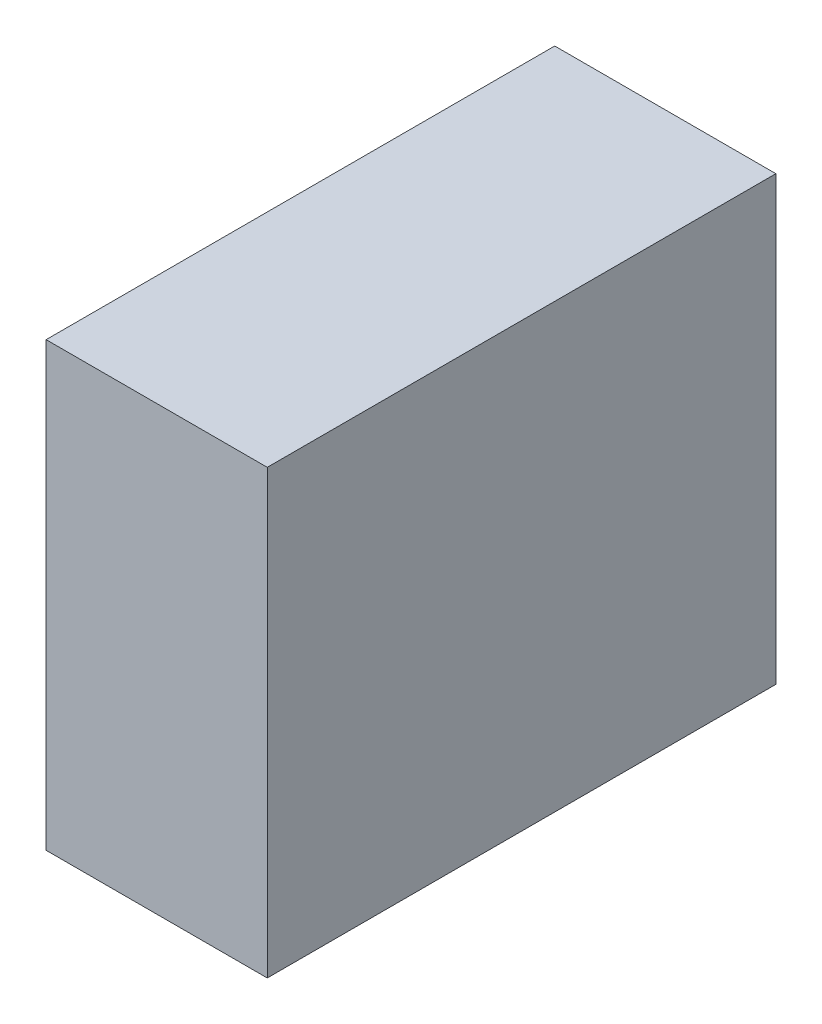
ISO-10303-21;
HEADER;
FILE_DESCRIPTION(('STEP AP214'),'2;1');
FILE_NAME('part.step','',(''),(''),'','','');
FILE_SCHEMA(('AUTOMOTIVE_DESIGN { 1 0 10303 214 1 1 1 1 }'));
ENDSEC;
DATA;
#1=APPLICATION_CONTEXT('core data for automotive mechanical design processes');
#2=APPLICATION_PROTOCOL_DEFINITION('international standard','automotive_design',2000,#1);
#3=PRODUCT_CONTEXT('',#1,'mechanical');
#4=PRODUCT('Part','Part','',(#3));
#5=PRODUCT_RELATED_PRODUCT_CATEGORY('part','',(#4));
#6=PRODUCT_DEFINITION_FORMATION('','',#4);
#7=PRODUCT_DEFINITION_CONTEXT('part definition',#1,'design');
#8=PRODUCT_DEFINITION('design','',#6,#7);
#9=PRODUCT_DEFINITION_SHAPE('','',#8);
#10=(LENGTH_UNIT() NAMED_UNIT(*) SI_UNIT(.MILLI.,.METRE.));
#11=(NAMED_UNIT(*) PLANE_ANGLE_UNIT() SI_UNIT($,.RADIAN.));
#12=(NAMED_UNIT(*) SI_UNIT($,.STERADIAN.) SOLID_ANGLE_UNIT());
#13=UNCERTAINTY_MEASURE_WITH_UNIT(LENGTH_MEASURE(1.E-05),#10,'distance_accuracy_value','');
#14=(GEOMETRIC_REPRESENTATION_CONTEXT(3) GLOBAL_UNCERTAINTY_ASSIGNED_CONTEXT((#13)) GLOBAL_UNIT_ASSIGNED_CONTEXT((#10,
#11,#12)) REPRESENTATION_CONTEXT('',''));
#15=CARTESIAN_POINT('',(0.,0.,0.));
#16=DIRECTION('',(0.,0.,1.));
#17=DIRECTION('',(1.,0.,0.));
#18=AXIS2_PLACEMENT_3D('',#15,#16,#17);
#19=CARTESIAN_POINT('',(-10.,0.,0.));
#20=DIRECTION('',(0.,0.,1.));
#21=DIRECTION('',(1.,0.,0.));
#22=AXIS2_PLACEMENT_3D('',#19,#20,#21);
#23=PLANE('',#22);
#24=DIRECTION('',(0.,-1.,0.));
#25=VECTOR('',#24,1.);
#26=CARTESIAN_POINT('',(0.,0.,0.));
#27=LINE('',#26,#25);
#28=CARTESIAN_POINT('',(0.,20.,0.));
#29=VERTEX_POINT('',#28);
#30=CARTESIAN_POINT('',(0.,0.,0.));
#31=VERTEX_POINT('',#30);
#32=EDGE_CURVE('E104',#29,#31,#27,.T.);
#33=ORIENTED_EDGE('',*,*,#32,.F.);
#34=DIRECTION('',(1.,0.,0.));
#35=VECTOR('',#34,1.);
#36=CARTESIAN_POINT('',(-10.,20.,0.));
#37=LINE('',#36,#35);
#38=CARTESIAN_POINT('',(-10.,20.,0.));
#39=VERTEX_POINT('',#38);
#40=EDGE_CURVE('E11',#39,#29,#37,.T.);
#41=ORIENTED_EDGE('',*,*,#40,.F.);
#42=DIRECTION('',(0.,-1.,0.));
#43=VECTOR('',#42,1.);
#44=CARTESIAN_POINT('',(-10.,0.,0.));
#45=LINE('',#44,#43);
#46=CARTESIAN_POINT('',(-10.,0.,0.));
#47=VERTEX_POINT('',#46);
#48=EDGE_CURVE('E100',#39,#47,#45,.T.);
#49=ORIENTED_EDGE('',*,*,#48,.T.);
#50=DIRECTION('',(1.,0.,0.));
#51=VECTOR('',#50,1.);
#52=CARTESIAN_POINT('',(-10.,0.,0.));
#53=LINE('',#52,#51);
#54=EDGE_CURVE('E45',#47,#31,#53,.T.);
#55=ORIENTED_EDGE('',*,*,#54,.T.);
#56=EDGE_LOOP('',(#33,#41,#49,#55));
#57=FACE_BOUND('',#56,.T.);
#58=ADVANCED_FACE('F39',(#57),#23,.T.);
#59=CARTESIAN_POINT('',(-10.,20.,0.));
#60=DIRECTION('',(0.,1.,0.));
#61=DIRECTION('',(0.,0.,1.));
#62=AXIS2_PLACEMENT_3D('',#59,#60,#61);
#63=PLANE('',#62);
#64=DIRECTION('',(0.,0.,1.));
#65=VECTOR('',#64,1.);
#66=CARTESIAN_POINT('',(0.,20.,0.));
#67=LINE('',#66,#65);
#68=CARTESIAN_POINT('',(0.,20.,-23.));
#69=VERTEX_POINT('',#68);
#70=EDGE_CURVE('E98',#69,#29,#67,.T.);
#71=ORIENTED_EDGE('',*,*,#70,.F.);
#72=DIRECTION('',(1.,0.,0.));
#73=VECTOR('',#72,1.);
#74=CARTESIAN_POINT('',(-10.,20.,-23.));
#75=LINE('',#74,#73);
#76=CARTESIAN_POINT('',(-10.,20.,-23.));
#77=VERTEX_POINT('',#76);
#78=EDGE_CURVE('E48',#77,#69,#75,.T.);
#79=ORIENTED_EDGE('',*,*,#78,.F.);
#80=DIRECTION('',(0.,0.,1.));
#81=VECTOR('',#80,1.);
#82=CARTESIAN_POINT('',(-10.,20.,0.));
#83=LINE('',#82,#81);
#84=EDGE_CURVE('E92',#77,#39,#83,.T.);
#85=ORIENTED_EDGE('',*,*,#84,.T.);
#86=ORIENTED_EDGE('',*,*,#40,.T.);
#87=EDGE_LOOP('',(#71,#79,#85,#86));
#88=FACE_BOUND('',#87,.T.);
#89=ADVANCED_FACE('F111',(#88),#63,.T.);
#90=CARTESIAN_POINT('',(-10.,0.,-23.));
#91=DIRECTION('',(0.,0.,-1.));
#92=DIRECTION('',(-1.,0.,0.));
#93=AXIS2_PLACEMENT_3D('',#90,#91,#92);
#94=PLANE('',#93);
#95=DIRECTION('',(0.,1.,0.));
#96=VECTOR('',#95,1.);
#97=CARTESIAN_POINT('',(0.,0.,-23.));
#98=LINE('',#97,#96);
#99=CARTESIAN_POINT('',(0.,0.,-23.));
#100=VERTEX_POINT('',#99);
#101=EDGE_CURVE('E87',#100,#69,#98,.T.);
#102=ORIENTED_EDGE('',*,*,#101,.F.);
#103=DIRECTION('',(1.,0.,0.));
#104=VECTOR('',#103,1.);
#105=CARTESIAN_POINT('',(-10.,0.,-23.));
#106=LINE('',#105,#104);
#107=CARTESIAN_POINT('',(-10.,0.,-23.));
#108=VERTEX_POINT('',#107);
#109=EDGE_CURVE('E84',#108,#100,#106,.T.);
#110=ORIENTED_EDGE('',*,*,#109,.F.);
#111=DIRECTION('',(0.,1.,0.));
#112=VECTOR('',#111,1.);
#113=CARTESIAN_POINT('',(-10.,0.,-23.));
#114=LINE('',#113,#112);
#115=EDGE_CURVE('E90',#108,#77,#114,.T.);
#116=ORIENTED_EDGE('',*,*,#115,.T.);
#117=ORIENTED_EDGE('',*,*,#78,.T.);
#118=EDGE_LOOP('',(#102,#110,#116,#117));
#119=FACE_BOUND('',#118,.T.);
#120=ADVANCED_FACE('F86',(#119),#94,.T.);
#121=CARTESIAN_POINT('',(-10.,0.,0.));
#122=DIRECTION('',(0.,-1.,0.));
#123=DIRECTION('',(0.,0.,-1.));
#124=AXIS2_PLACEMENT_3D('',#121,#122,#123);
#125=PLANE('',#124);
#126=DIRECTION('',(0.,0.,-1.));
#127=VECTOR('',#126,1.);
#128=CARTESIAN_POINT('',(0.,0.,0.));
#129=LINE('',#128,#127);
#130=EDGE_CURVE('E106',#31,#100,#129,.T.);
#131=ORIENTED_EDGE('',*,*,#130,.F.);
#132=ORIENTED_EDGE('',*,*,#54,.F.);
#133=DIRECTION('',(0.,0.,-1.));
#134=VECTOR('',#133,1.);
#135=CARTESIAN_POINT('',(-10.,0.,0.));
#136=LINE('',#135,#134);
#137=EDGE_CURVE('E93',#47,#108,#136,.T.);
#138=ORIENTED_EDGE('',*,*,#137,.T.);
#139=ORIENTED_EDGE('',*,*,#109,.T.);
#140=EDGE_LOOP('',(#131,#132,#138,#139));
#141=FACE_BOUND('',#140,.T.);
#142=ADVANCED_FACE('F96',(#141),#125,.T.);
#143=CARTESIAN_POINT('',(-10.,0.,0.));
#144=DIRECTION('',(-1.,0.,0.));
#145=DIRECTION('',(0.,0.,1.));
#146=AXIS2_PLACEMENT_3D('',#143,#144,#145);
#147=PLANE('',#146);
#148=ORIENTED_EDGE('',*,*,#48,.F.);
#149=ORIENTED_EDGE('',*,*,#84,.F.);
#150=ORIENTED_EDGE('',*,*,#115,.F.);
#151=ORIENTED_EDGE('',*,*,#137,.F.);
#152=EDGE_LOOP('',(#148,#149,#150,#151));
#153=FACE_BOUND('',#152,.T.);
#154=ADVANCED_FACE('F95',(#153),#147,.T.);
#155=CARTESIAN_POINT('',(0.,0.,0.));
#156=DIRECTION('',(-1.,0.,0.));
#157=DIRECTION('',(0.,0.,1.));
#158=AXIS2_PLACEMENT_3D('',#155,#156,#157);
#159=PLANE('',#158);
#160=ORIENTED_EDGE('',*,*,#32,.T.);
#161=ORIENTED_EDGE('',*,*,#130,.T.);
#162=ORIENTED_EDGE('',*,*,#101,.T.);
#163=ORIENTED_EDGE('',*,*,#70,.T.);
#164=EDGE_LOOP('',(#160,#161,#162,#163));
#165=FACE_BOUND('',#164,.T.);
#166=ADVANCED_FACE('F115',(#165),#159,.F.);
#167=CLOSED_SHELL('',(#58,#89,#120,#142,#154,#166));
#168=MANIFOLD_SOLID_BREP('B2',#167);
#169=ADVANCED_BREP_SHAPE_REPRESENTATION('',(#18,#168),#14);
#170=SHAPE_DEFINITION_REPRESENTATION(#9,#169);
ENDSEC;
END-ISO-10303-21;
